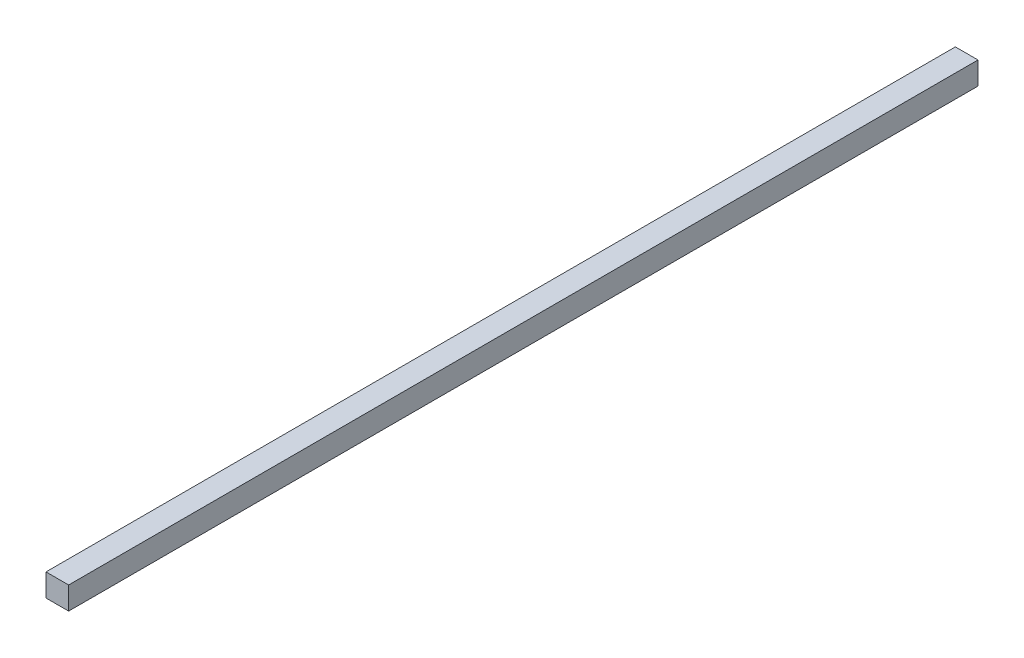
ISO-10303-21;
HEADER;
FILE_DESCRIPTION(('STEP AP214'),'2;1');
FILE_NAME('part.step','',(''),(''),'','','');
FILE_SCHEMA(('AUTOMOTIVE_DESIGN { 1 0 10303 214 1 1 1 1 }'));
ENDSEC;
DATA;
#1=APPLICATION_CONTEXT('core data for automotive mechanical design processes');
#2=APPLICATION_PROTOCOL_DEFINITION('international standard','automotive_design',2000,#1);
#3=PRODUCT_CONTEXT('',#1,'mechanical');
#4=PRODUCT('Part','Part','',(#3));
#5=PRODUCT_RELATED_PRODUCT_CATEGORY('part','',(#4));
#6=PRODUCT_DEFINITION_FORMATION('','',#4);
#7=PRODUCT_DEFINITION_CONTEXT('part definition',#1,'design');
#8=PRODUCT_DEFINITION('design','',#6,#7);
#9=PRODUCT_DEFINITION_SHAPE('','',#8);
#10=(LENGTH_UNIT() NAMED_UNIT(*) SI_UNIT(.MILLI.,.METRE.));
#11=(NAMED_UNIT(*) PLANE_ANGLE_UNIT() SI_UNIT($,.RADIAN.));
#12=(NAMED_UNIT(*) SI_UNIT($,.STERADIAN.) SOLID_ANGLE_UNIT());
#13=UNCERTAINTY_MEASURE_WITH_UNIT(LENGTH_MEASURE(1.E-05),#10,'distance_accuracy_value','');
#14=(GEOMETRIC_REPRESENTATION_CONTEXT(3) GLOBAL_UNCERTAINTY_ASSIGNED_CONTEXT((#13)) GLOBAL_UNIT_ASSIGNED_CONTEXT((#10,
#11,#12)) REPRESENTATION_CONTEXT('',''));
#15=CARTESIAN_POINT('',(0.,0.,0.));
#16=DIRECTION('',(0.,0.,1.));
#17=DIRECTION('',(1.,0.,0.));
#18=AXIS2_PLACEMENT_3D('',#15,#16,#17);
#19=CARTESIAN_POINT('',(-3.175,-3.175,127.5));
#20=DIRECTION('',(1.,0.,0.));
#21=DIRECTION('',(0.,1.,0.));
#22=AXIS2_PLACEMENT_3D('',#19,#20,#21);
#23=PLANE('',#22);
#24=DIRECTION('',(0.,-1.,0.));
#25=VECTOR('',#24,1.);
#26=CARTESIAN_POINT('',(-3.175,-3.175,-127.5));
#27=LINE('',#26,#25);
#28=CARTESIAN_POINT('',(-3.175,3.175,-127.5));
#29=VERTEX_POINT('',#28);
#30=CARTESIAN_POINT('',(-3.175,-3.175,-127.5));
#31=VERTEX_POINT('',#30);
#32=EDGE_CURVE('E109',#29,#31,#27,.T.);
#33=ORIENTED_EDGE('',*,*,#32,.T.);
#34=DIRECTION('',(0.,0.,-1.));
#35=VECTOR('',#34,1.);
#36=CARTESIAN_POINT('',(-3.175,-3.175,127.5));
#37=LINE('',#36,#35);
#38=CARTESIAN_POINT('',(-3.175,-3.175,127.5));
#39=VERTEX_POINT('',#38);
#40=EDGE_CURVE('E11',#39,#31,#37,.T.);
#41=ORIENTED_EDGE('',*,*,#40,.F.);
#42=DIRECTION('',(0.,-1.,0.));
#43=VECTOR('',#42,1.);
#44=CARTESIAN_POINT('',(-3.175,-3.175,127.5));
#45=LINE('',#44,#43);
#46=CARTESIAN_POINT('',(-3.175,3.175,127.5));
#47=VERTEX_POINT('',#46);
#48=EDGE_CURVE('E93',#47,#39,#45,.T.);
#49=ORIENTED_EDGE('',*,*,#48,.F.);
#50=DIRECTION('',(0.,0.,-1.));
#51=VECTOR('',#50,1.);
#52=CARTESIAN_POINT('',(-3.175,3.175,127.5));
#53=LINE('',#52,#51);
#54=EDGE_CURVE('E105',#47,#29,#53,.T.);
#55=ORIENTED_EDGE('',*,*,#54,.T.);
#56=EDGE_LOOP('',(#33,#41,#49,#55));
#57=FACE_BOUND('',#56,.T.);
#58=ADVANCED_FACE('F41',(#57),#23,.F.);
#59=CARTESIAN_POINT('',(3.175,-3.175,127.5));
#60=DIRECTION('',(0.,1.,0.));
#61=DIRECTION('',(-1.,0.,0.));
#62=AXIS2_PLACEMENT_3D('',#59,#60,#61);
#63=PLANE('',#62);
#64=DIRECTION('',(1.,0.,0.));
#65=VECTOR('',#64,1.);
#66=CARTESIAN_POINT('',(3.175,-3.175,-127.5));
#67=LINE('',#66,#65);
#68=CARTESIAN_POINT('',(3.175,-3.175,-127.5));
#69=VERTEX_POINT('',#68);
#70=EDGE_CURVE('E98',#31,#69,#67,.T.);
#71=ORIENTED_EDGE('',*,*,#70,.T.);
#72=DIRECTION('',(0.,0.,-1.));
#73=VECTOR('',#72,1.);
#74=CARTESIAN_POINT('',(3.175,-3.175,127.5));
#75=LINE('',#74,#73);
#76=CARTESIAN_POINT('',(3.175,-3.175,127.5));
#77=VERTEX_POINT('',#76);
#78=EDGE_CURVE('E50',#77,#69,#75,.T.);
#79=ORIENTED_EDGE('',*,*,#78,.F.);
#80=DIRECTION('',(1.,0.,0.));
#81=VECTOR('',#80,1.);
#82=CARTESIAN_POINT('',(3.175,-3.175,127.5));
#83=LINE('',#82,#81);
#84=EDGE_CURVE('E88',#39,#77,#83,.T.);
#85=ORIENTED_EDGE('',*,*,#84,.F.);
#86=ORIENTED_EDGE('',*,*,#40,.T.);
#87=EDGE_LOOP('',(#71,#79,#85,#86));
#88=FACE_BOUND('',#87,.T.);
#89=ADVANCED_FACE('F97',(#88),#63,.F.);
#90=CARTESIAN_POINT('',(3.175,3.175,127.5));
#91=DIRECTION('',(-1.,0.,0.));
#92=DIRECTION('',(0.,-1.,0.));
#93=AXIS2_PLACEMENT_3D('',#90,#91,#92);
#94=PLANE('',#93);
#95=DIRECTION('',(0.,1.,0.));
#96=VECTOR('',#95,1.);
#97=CARTESIAN_POINT('',(3.175,3.175,-127.5));
#98=LINE('',#97,#96);
#99=CARTESIAN_POINT('',(3.175,3.175,-127.5));
#100=VERTEX_POINT('',#99);
#101=EDGE_CURVE('E75',#69,#100,#98,.T.);
#102=ORIENTED_EDGE('',*,*,#101,.T.);
#103=DIRECTION('',(0.,0.,-1.));
#104=VECTOR('',#103,1.);
#105=CARTESIAN_POINT('',(3.175,3.175,127.5));
#106=LINE('',#105,#104);
#107=CARTESIAN_POINT('',(3.175,3.175,127.5));
#108=VERTEX_POINT('',#107);
#109=EDGE_CURVE('E100',#108,#100,#106,.T.);
#110=ORIENTED_EDGE('',*,*,#109,.F.);
#111=DIRECTION('',(0.,1.,0.));
#112=VECTOR('',#111,1.);
#113=CARTESIAN_POINT('',(3.175,3.175,127.5));
#114=LINE('',#113,#112);
#115=EDGE_CURVE('E91',#77,#108,#114,.T.);
#116=ORIENTED_EDGE('',*,*,#115,.F.);
#117=ORIENTED_EDGE('',*,*,#78,.T.);
#118=EDGE_LOOP('',(#102,#110,#116,#117));
#119=FACE_BOUND('',#118,.T.);
#120=ADVANCED_FACE('F101',(#119),#94,.F.);
#121=CARTESIAN_POINT('',(-3.175,3.175,127.5));
#122=DIRECTION('',(0.,-1.,0.));
#123=DIRECTION('',(1.,0.,0.));
#124=AXIS2_PLACEMENT_3D('',#121,#122,#123);
#125=PLANE('',#124);
#126=DIRECTION('',(-1.,0.,0.));
#127=VECTOR('',#126,1.);
#128=CARTESIAN_POINT('',(-3.175,3.175,-127.5));
#129=LINE('',#128,#127);
#130=EDGE_CURVE('E81',#100,#29,#129,.T.);
#131=ORIENTED_EDGE('',*,*,#130,.T.);
#132=ORIENTED_EDGE('',*,*,#54,.F.);
#133=DIRECTION('',(-1.,0.,0.));
#134=VECTOR('',#133,1.);
#135=CARTESIAN_POINT('',(-3.175,3.175,127.5));
#136=LINE('',#135,#134);
#137=EDGE_CURVE('E58',#108,#47,#136,.T.);
#138=ORIENTED_EDGE('',*,*,#137,.F.);
#139=ORIENTED_EDGE('',*,*,#109,.T.);
#140=EDGE_LOOP('',(#131,#132,#138,#139));
#141=FACE_BOUND('',#140,.T.);
#142=ADVANCED_FACE('F122',(#141),#125,.F.);
#143=CARTESIAN_POINT('',(0.,0.,127.5));
#144=DIRECTION('',(0.,0.,-1.));
#145=DIRECTION('',(-1.,0.,0.));
#146=AXIS2_PLACEMENT_3D('',#143,#144,#145);
#147=PLANE('',#146);
#148=ORIENTED_EDGE('',*,*,#48,.T.);
#149=ORIENTED_EDGE('',*,*,#84,.T.);
#150=ORIENTED_EDGE('',*,*,#115,.T.);
#151=ORIENTED_EDGE('',*,*,#137,.T.);
#152=EDGE_LOOP('',(#148,#149,#150,#151));
#153=FACE_BOUND('',#152,.T.);
#154=ADVANCED_FACE('F89',(#153),#147,.F.);
#155=CARTESIAN_POINT('',(0.,0.,-127.5));
#156=DIRECTION('',(0.,0.,-1.));
#157=DIRECTION('',(-1.,0.,0.));
#158=AXIS2_PLACEMENT_3D('',#155,#156,#157);
#159=PLANE('',#158);
#160=ORIENTED_EDGE('',*,*,#32,.F.);
#161=ORIENTED_EDGE('',*,*,#130,.F.);
#162=ORIENTED_EDGE('',*,*,#101,.F.);
#163=ORIENTED_EDGE('',*,*,#70,.F.);
#164=EDGE_LOOP('',(#160,#161,#162,#163));
#165=FACE_BOUND('',#164,.T.);
#166=ADVANCED_FACE('F125',(#165),#159,.T.);
#167=CLOSED_SHELL('',(#58,#89,#120,#142,#154,#166));
#168=MANIFOLD_SOLID_BREP('B2',#167);
#169=ADVANCED_BREP_SHAPE_REPRESENTATION('',(#18,#168),#14);
#170=SHAPE_DEFINITION_REPRESENTATION(#9,#169);
ENDSEC;
END-ISO-10303-21;
